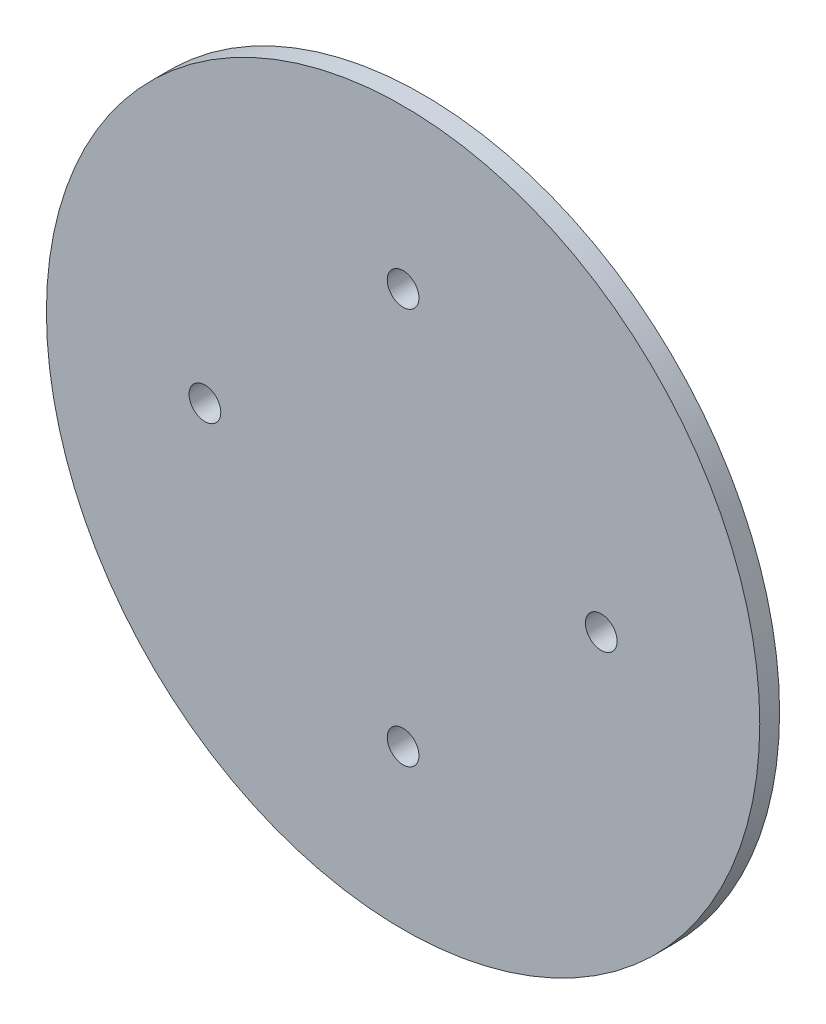
ISO-10303-21;
HEADER;
FILE_DESCRIPTION(('STEP AP214'),'2;1');
FILE_NAME('part.step','',(''),(''),'','','');
FILE_SCHEMA(('AUTOMOTIVE_DESIGN { 1 0 10303 214 1 1 1 1 }'));
ENDSEC;
DATA;
#1=APPLICATION_CONTEXT('core data for automotive mechanical design processes');
#2=APPLICATION_PROTOCOL_DEFINITION('international standard','automotive_design',2000,#1);
#3=PRODUCT_CONTEXT('',#1,'mechanical');
#4=PRODUCT('Part','Part','',(#3));
#5=PRODUCT_RELATED_PRODUCT_CATEGORY('part','',(#4));
#6=PRODUCT_DEFINITION_FORMATION('','',#4);
#7=PRODUCT_DEFINITION_CONTEXT('part definition',#1,'design');
#8=PRODUCT_DEFINITION('design','',#6,#7);
#9=PRODUCT_DEFINITION_SHAPE('','',#8);
#10=(LENGTH_UNIT() NAMED_UNIT(*) SI_UNIT(.MILLI.,.METRE.));
#11=(NAMED_UNIT(*) PLANE_ANGLE_UNIT() SI_UNIT($,.RADIAN.));
#12=(NAMED_UNIT(*) SI_UNIT($,.STERADIAN.) SOLID_ANGLE_UNIT());
#13=UNCERTAINTY_MEASURE_WITH_UNIT(LENGTH_MEASURE(1.E-05),#10,'distance_accuracy_value','');
#14=(GEOMETRIC_REPRESENTATION_CONTEXT(3) GLOBAL_UNCERTAINTY_ASSIGNED_CONTEXT((#13)) GLOBAL_UNIT_ASSIGNED_CONTEXT((#10,
#11,#12)) REPRESENTATION_CONTEXT('',''));
#15=CARTESIAN_POINT('',(0.,0.,0.));
#16=DIRECTION('',(0.,0.,1.));
#17=DIRECTION('',(1.,0.,0.));
#18=AXIS2_PLACEMENT_3D('',#15,#16,#17);
#19=CARTESIAN_POINT('',(0.,0.,4.));
#20=DIRECTION('',(0.,0.,-1.));
#21=DIRECTION('',(-1.,0.,0.));
#22=AXIS2_PLACEMENT_3D('',#19,#20,#21);
#23=CYLINDRICAL_SURFACE('',#22,23.5);
#24=CARTESIAN_POINT('',(0.,0.,4.));
#25=DIRECTION('',(0.,0.,1.));
#26=DIRECTION('',(1.,0.,0.));
#27=AXIS2_PLACEMENT_3D('',#24,#25,#26);
#28=CIRCLE('',#27,23.5);
#29=CARTESIAN_POINT('',(23.5,0.,4.));
#30=VERTEX_POINT('',#29);
#31=EDGE_CURVE('E42',#30,#30,#28,.T.);
#32=ORIENTED_EDGE('',*,*,#31,.F.);
#33=EDGE_LOOP('',(#32));
#34=FACE_BOUND('',#33,.T.);
#35=CARTESIAN_POINT('',(0.,0.,0.));
#36=DIRECTION('',(0.,0.,1.));
#37=DIRECTION('',(1.,0.,0.));
#38=AXIS2_PLACEMENT_3D('',#35,#36,#37);
#39=CIRCLE('',#38,23.5);
#40=CARTESIAN_POINT('',(23.5,0.,0.));
#41=VERTEX_POINT('',#40);
#42=EDGE_CURVE('E38',#41,#41,#39,.T.);
#43=ORIENTED_EDGE('',*,*,#42,.T.);
#44=EDGE_LOOP('',(#43));
#45=FACE_BOUND('',#44,.T.);
#46=ADVANCED_FACE('F35',(#34,#45),#23,.T.);
#47=CARTESIAN_POINT('',(0.,0.,0.));
#48=DIRECTION('',(0.,0.,1.));
#49=DIRECTION('',(1.,0.,0.));
#50=AXIS2_PLACEMENT_3D('',#47,#48,#49);
#51=PLANE('',#50);
#52=CARTESIAN_POINT('',(0.,0.,0.));
#53=DIRECTION('',(0.,0.,-1.));
#54=DIRECTION('',(-1.,0.,0.));
#55=AXIS2_PLACEMENT_3D('',#52,#53,#54);
#56=CIRCLE('',#55,22.225);
#57=CARTESIAN_POINT('',(-22.225,0.,0.));
#58=VERTEX_POINT('',#57);
#59=EDGE_CURVE('E10',#58,#58,#56,.T.);
#60=ORIENTED_EDGE('',*,*,#59,.F.);
#61=EDGE_LOOP('',(#60));
#62=FACE_BOUND('',#61,.T.);
#63=ORIENTED_EDGE('',*,*,#42,.F.);
#64=EDGE_LOOP('',(#63));
#65=FACE_BOUND('',#64,.T.);
#66=ADVANCED_FACE('F103',(#62,#65),#51,.F.);
#67=CARTESIAN_POINT('',(0.,0.,-3.175));
#68=DIRECTION('',(0.,0.,1.));
#69=DIRECTION('',(1.,0.,0.));
#70=AXIS2_PLACEMENT_3D('',#67,#68,#69);
#71=CYLINDRICAL_SURFACE('',#70,22.225);
#72=CARTESIAN_POINT('',(0.,0.,-3.175));
#73=DIRECTION('',(0.,0.,-1.));
#74=DIRECTION('',(-1.,0.,0.));
#75=AXIS2_PLACEMENT_3D('',#72,#73,#74);
#76=CIRCLE('',#75,22.225);
#77=CARTESIAN_POINT('',(-22.225,0.,-3.175));
#78=VERTEX_POINT('',#77);
#79=EDGE_CURVE('E48',#78,#78,#76,.T.);
#80=ORIENTED_EDGE('',*,*,#79,.F.);
#81=EDGE_LOOP('',(#80));
#82=FACE_BOUND('',#81,.T.);
#83=ORIENTED_EDGE('',*,*,#59,.T.);
#84=EDGE_LOOP('',(#83));
#85=FACE_BOUND('',#84,.T.);
#86=ADVANCED_FACE('F108',(#82,#85),#71,.T.);
#87=CARTESIAN_POINT('',(0.,0.,-3.175));
#88=DIRECTION('',(0.,0.,-1.));
#89=DIRECTION('',(-1.,0.,0.));
#90=AXIS2_PLACEMENT_3D('',#87,#88,#89);
#91=PLANE('',#90);
#92=CARTESIAN_POINT('',(0.,20.,-3.175));
#93=DIRECTION('',(0.,0.,-1.));
#94=DIRECTION('',(-1.,0.,0.));
#95=AXIS2_PLACEMENT_3D('',#92,#93,#94);
#96=CIRCLE('',#95,1.6);
#97=CARTESIAN_POINT('',(-1.6,20.,-3.175));
#98=VERTEX_POINT('',#97);
#99=EDGE_CURVE('E51',#98,#98,#96,.T.);
#100=ORIENTED_EDGE('',*,*,#99,.F.);
#101=EDGE_LOOP('',(#100));
#102=FACE_BOUND('',#101,.T.);
#103=CARTESIAN_POINT('',(-20.,0.,-3.175));
#104=DIRECTION('',(0.,0.,-1.));
#105=DIRECTION('',(-1.,0.,0.));
#106=AXIS2_PLACEMENT_3D('',#103,#104,#105);
#107=CIRCLE('',#106,1.6);
#108=CARTESIAN_POINT('',(-21.6,0.,-3.175));
#109=VERTEX_POINT('',#108);
#110=EDGE_CURVE('E59',#109,#109,#107,.T.);
#111=ORIENTED_EDGE('',*,*,#110,.F.);
#112=EDGE_LOOP('',(#111));
#113=FACE_BOUND('',#112,.T.);
#114=CARTESIAN_POINT('',(0.,-20.,-3.175));
#115=DIRECTION('',(0.,0.,-1.));
#116=DIRECTION('',(-1.,0.,0.));
#117=AXIS2_PLACEMENT_3D('',#114,#115,#116);
#118=CIRCLE('',#117,1.6);
#119=CARTESIAN_POINT('',(-1.6,-20.,-3.175));
#120=VERTEX_POINT('',#119);
#121=EDGE_CURVE('E55',#120,#120,#118,.T.);
#122=ORIENTED_EDGE('',*,*,#121,.F.);
#123=EDGE_LOOP('',(#122));
#124=FACE_BOUND('',#123,.T.);
#125=CARTESIAN_POINT('',(20.,0.,-3.175));
#126=DIRECTION('',(0.,0.,-1.));
#127=DIRECTION('',(-1.,0.,0.));
#128=AXIS2_PLACEMENT_3D('',#125,#126,#127);
#129=CIRCLE('',#128,1.6);
#130=CARTESIAN_POINT('',(18.4,0.,-3.175));
#131=VERTEX_POINT('',#130);
#132=EDGE_CURVE('E52',#131,#131,#129,.T.);
#133=ORIENTED_EDGE('',*,*,#132,.F.);
#134=EDGE_LOOP('',(#133));
#135=FACE_BOUND('',#134,.T.);
#136=ORIENTED_EDGE('',*,*,#79,.T.);
#137=EDGE_LOOP('',(#136));
#138=FACE_BOUND('',#137,.T.);
#139=ADVANCED_FACE('F134',(#102,#113,#124,#135,#138),#91,.T.);
#140=CARTESIAN_POINT('',(20.,0.,4.));
#141=DIRECTION('',(0.,0.,-1.));
#142=DIRECTION('',(-1.,0.,0.));
#143=AXIS2_PLACEMENT_3D('',#140,#141,#142);
#144=CYLINDRICAL_SURFACE('',#143,1.6);
#145=ORIENTED_EDGE('',*,*,#132,.T.);
#146=EDGE_LOOP('',(#145));
#147=FACE_BOUND('',#146,.T.);
#148=CARTESIAN_POINT('',(20.,0.,6.));
#149=DIRECTION('',(0.,0.,1.));
#150=DIRECTION('',(1.,0.,0.));
#151=AXIS2_PLACEMENT_3D('',#148,#149,#150);
#152=CIRCLE('',#151,1.6);
#153=CARTESIAN_POINT('',(21.6,0.,6.));
#154=VERTEX_POINT('',#153);
#155=EDGE_CURVE('E78',#154,#154,#152,.T.);
#156=ORIENTED_EDGE('',*,*,#155,.T.);
#157=EDGE_LOOP('',(#156));
#158=FACE_BOUND('',#157,.T.);
#159=ADVANCED_FACE('F82',(#147,#158),#144,.F.);
#160=CARTESIAN_POINT('',(0.,-20.,4.));
#161=DIRECTION('',(0.,0.,-1.));
#162=DIRECTION('',(-1.,0.,0.));
#163=AXIS2_PLACEMENT_3D('',#160,#161,#162);
#164=CYLINDRICAL_SURFACE('',#163,1.6);
#165=ORIENTED_EDGE('',*,*,#121,.T.);
#166=EDGE_LOOP('',(#165));
#167=FACE_BOUND('',#166,.T.);
#168=CARTESIAN_POINT('',(0.,-20.,6.));
#169=DIRECTION('',(0.,0.,1.));
#170=DIRECTION('',(1.,0.,0.));
#171=AXIS2_PLACEMENT_3D('',#168,#169,#170);
#172=CIRCLE('',#171,1.6);
#173=CARTESIAN_POINT('',(1.6,-20.,6.));
#174=VERTEX_POINT('',#173);
#175=EDGE_CURVE('E75',#174,#174,#172,.T.);
#176=ORIENTED_EDGE('',*,*,#175,.T.);
#177=EDGE_LOOP('',(#176));
#178=FACE_BOUND('',#177,.T.);
#179=ADVANCED_FACE('F127',(#167,#178),#164,.F.);
#180=CARTESIAN_POINT('',(-20.,0.,4.));
#181=DIRECTION('',(0.,0.,-1.));
#182=DIRECTION('',(-1.,0.,0.));
#183=AXIS2_PLACEMENT_3D('',#180,#181,#182);
#184=CYLINDRICAL_SURFACE('',#183,1.6);
#185=ORIENTED_EDGE('',*,*,#110,.T.);
#186=EDGE_LOOP('',(#185));
#187=FACE_BOUND('',#186,.T.);
#188=CARTESIAN_POINT('',(-20.,0.,6.));
#189=DIRECTION('',(0.,0.,1.));
#190=DIRECTION('',(1.,0.,0.));
#191=AXIS2_PLACEMENT_3D('',#188,#189,#190);
#192=CIRCLE('',#191,1.6);
#193=CARTESIAN_POINT('',(-18.4,0.,6.));
#194=VERTEX_POINT('',#193);
#195=EDGE_CURVE('E72',#194,#194,#192,.T.);
#196=ORIENTED_EDGE('',*,*,#195,.T.);
#197=EDGE_LOOP('',(#196));
#198=FACE_BOUND('',#197,.T.);
#199=ADVANCED_FACE('F97',(#187,#198),#184,.F.);
#200=CARTESIAN_POINT('',(0.,20.,4.));
#201=DIRECTION('',(0.,0.,-1.));
#202=DIRECTION('',(-1.,0.,0.));
#203=AXIS2_PLACEMENT_3D('',#200,#201,#202);
#204=CYLINDRICAL_SURFACE('',#203,1.6);
#205=ORIENTED_EDGE('',*,*,#99,.T.);
#206=EDGE_LOOP('',(#205));
#207=FACE_BOUND('',#206,.T.);
#208=CARTESIAN_POINT('',(0.,20.,6.));
#209=DIRECTION('',(0.,0.,1.));
#210=DIRECTION('',(1.,0.,0.));
#211=AXIS2_PLACEMENT_3D('',#208,#209,#210);
#212=CIRCLE('',#211,1.6);
#213=CARTESIAN_POINT('',(1.6,20.,6.));
#214=VERTEX_POINT('',#213);
#215=EDGE_CURVE('E67',#214,#214,#212,.T.);
#216=ORIENTED_EDGE('',*,*,#215,.T.);
#217=EDGE_LOOP('',(#216));
#218=FACE_BOUND('',#217,.T.);
#219=ADVANCED_FACE('F87',(#207,#218),#204,.F.);
#220=CARTESIAN_POINT('',(0.,0.,6.));
#221=DIRECTION('',(0.,0.,1.));
#222=DIRECTION('',(1.,0.,0.));
#223=AXIS2_PLACEMENT_3D('',#220,#221,#222);
#224=PLANE('',#223);
#225=ORIENTED_EDGE('',*,*,#175,.F.);
#226=EDGE_LOOP('',(#225));
#227=FACE_BOUND('',#226,.T.);
#228=ORIENTED_EDGE('',*,*,#215,.F.);
#229=EDGE_LOOP('',(#228));
#230=FACE_BOUND('',#229,.T.);
#231=CARTESIAN_POINT('',(0.,0.,6.));
#232=DIRECTION('',(0.,0.,1.));
#233=DIRECTION('',(1.,0.,0.));
#234=AXIS2_PLACEMENT_3D('',#231,#232,#233);
#235=CIRCLE('',#234,36.);
#236=CARTESIAN_POINT('',(36.,0.,6.));
#237=VERTEX_POINT('',#236);
#238=EDGE_CURVE('E56',#237,#237,#235,.T.);
#239=ORIENTED_EDGE('',*,*,#238,.T.);
#240=EDGE_LOOP('',(#239));
#241=FACE_BOUND('',#240,.T.);
#242=ORIENTED_EDGE('',*,*,#195,.F.);
#243=EDGE_LOOP('',(#242));
#244=FACE_BOUND('',#243,.T.);
#245=ORIENTED_EDGE('',*,*,#155,.F.);
#246=EDGE_LOOP('',(#245));
#247=FACE_BOUND('',#246,.T.);
#248=ADVANCED_FACE('F84',(#227,#230,#241,#244,#247),#224,.T.);
#249=CARTESIAN_POINT('',(0.,0.,4.));
#250=DIRECTION('',(0.,0.,1.));
#251=DIRECTION('',(1.,0.,0.));
#252=AXIS2_PLACEMENT_3D('',#249,#250,#251);
#253=PLANE('',#252);
#254=ORIENTED_EDGE('',*,*,#31,.T.);
#255=EDGE_LOOP('',(#254));
#256=FACE_BOUND('',#255,.T.);
#257=CARTESIAN_POINT('',(0.,0.,4.));
#258=DIRECTION('',(0.,0.,1.));
#259=DIRECTION('',(1.,0.,0.));
#260=AXIS2_PLACEMENT_3D('',#257,#258,#259);
#261=CIRCLE('',#260,36.);
#262=CARTESIAN_POINT('',(36.,0.,4.));
#263=VERTEX_POINT('',#262);
#264=EDGE_CURVE('E64',#263,#263,#261,.T.);
#265=ORIENTED_EDGE('',*,*,#264,.F.);
#266=EDGE_LOOP('',(#265));
#267=FACE_BOUND('',#266,.T.);
#268=ADVANCED_FACE('F86',(#256,#267),#253,.F.);
#269=CARTESIAN_POINT('',(0.,0.,6.));
#270=DIRECTION('',(0.,0.,-1.));
#271=DIRECTION('',(-1.,0.,0.));
#272=AXIS2_PLACEMENT_3D('',#269,#270,#271);
#273=CYLINDRICAL_SURFACE('',#272,36.);
#274=ORIENTED_EDGE('',*,*,#238,.F.);
#275=EDGE_LOOP('',(#274));
#276=FACE_BOUND('',#275,.T.);
#277=ORIENTED_EDGE('',*,*,#264,.T.);
#278=EDGE_LOOP('',(#277));
#279=FACE_BOUND('',#278,.T.);
#280=ADVANCED_FACE('F94',(#276,#279),#273,.T.);
#281=CLOSED_SHELL('',(#46,#66,#86,#139,#159,#179,#199,#219,#248,#268,#280));
#282=MANIFOLD_SOLID_BREP('B2',#281);
#283=ADVANCED_BREP_SHAPE_REPRESENTATION('',(#18,#282),#14);
#284=SHAPE_DEFINITION_REPRESENTATION(#9,#283);
ENDSEC;
END-ISO-10303-21;
